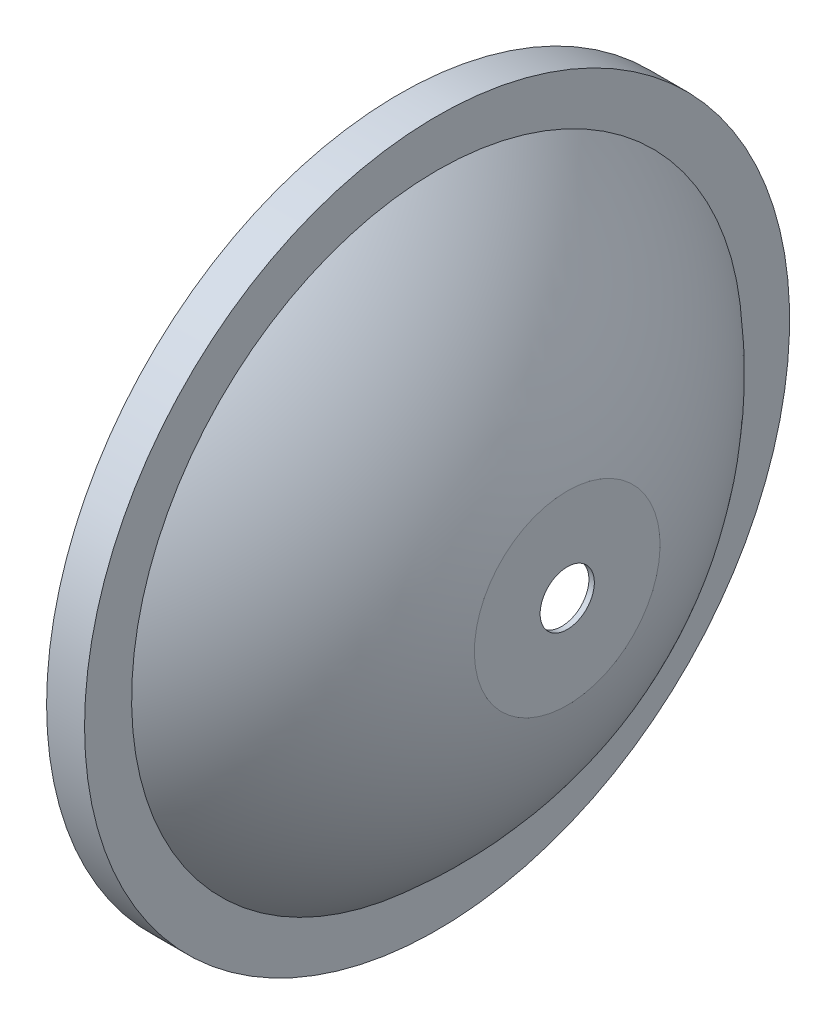
ISO-10303-21;
HEADER;
FILE_DESCRIPTION(('STEP AP214'),'2;1');
FILE_NAME('part.step','',(''),(''),'','','');
FILE_SCHEMA(('AUTOMOTIVE_DESIGN { 1 0 10303 214 1 1 1 1 }'));
ENDSEC;
DATA;
#1=APPLICATION_CONTEXT('core data for automotive mechanical design processes');
#2=APPLICATION_PROTOCOL_DEFINITION('international standard','automotive_design',2000,#1);
#3=PRODUCT_CONTEXT('',#1,'mechanical');
#4=PRODUCT('Part','Part','',(#3));
#5=PRODUCT_RELATED_PRODUCT_CATEGORY('part','',(#4));
#6=PRODUCT_DEFINITION_FORMATION('','',#4);
#7=PRODUCT_DEFINITION_CONTEXT('part definition',#1,'design');
#8=PRODUCT_DEFINITION('design','',#6,#7);
#9=PRODUCT_DEFINITION_SHAPE('','',#8);
#10=(LENGTH_UNIT() NAMED_UNIT(*) SI_UNIT(.MILLI.,.METRE.));
#11=(NAMED_UNIT(*) PLANE_ANGLE_UNIT() SI_UNIT($,.RADIAN.));
#12=(NAMED_UNIT(*) SI_UNIT($,.STERADIAN.) SOLID_ANGLE_UNIT());
#13=UNCERTAINTY_MEASURE_WITH_UNIT(LENGTH_MEASURE(1.E-05),#10,'distance_accuracy_value','');
#14=(GEOMETRIC_REPRESENTATION_CONTEXT(3) GLOBAL_UNCERTAINTY_ASSIGNED_CONTEXT((#13)) GLOBAL_UNIT_ASSIGNED_CONTEXT((#10,
#11,#12)) REPRESENTATION_CONTEXT('',''));
#15=CARTESIAN_POINT('',(0.,0.,0.));
#16=DIRECTION('',(0.,0.,1.));
#17=DIRECTION('',(1.,0.,0.));
#18=AXIS2_PLACEMENT_3D('',#15,#16,#17);
#19=CARTESIAN_POINT('',(-29.9929573971954,65.,0.));
#20=DIRECTION('',(1.,0.,0.));
#21=DIRECTION('',(0.,0.,-1.));
#22=AXIS2_PLACEMENT_3D('',#19,#20,#21);
#23=PLANE('',#22);
#24=CARTESIAN_POINT('',(-29.9929573971954,0.,0.));
#25=DIRECTION('',(-1.,0.,0.));
#26=DIRECTION('',(0.,0.,1.));
#27=AXIS2_PLACEMENT_3D('',#24,#25,#26);
#28=CIRCLE('',#27,64.);
#29=CARTESIAN_POINT('',(-29.9929573971954,0.,64.));
#30=VERTEX_POINT('',#29);
#31=EDGE_CURVE('E10',#30,#30,#28,.T.);
#32=ORIENTED_EDGE('',*,*,#31,.F.);
#33=EDGE_LOOP('',(#32));
#34=FACE_BOUND('',#33,.T.);
#35=CARTESIAN_POINT('',(-29.9929573971954,0.,0.));
#36=DIRECTION('',(-1.,0.,0.));
#37=DIRECTION('',(0.,0.,1.));
#38=AXIS2_PLACEMENT_3D('',#35,#36,#37);
#39=CIRCLE('',#38,65.);
#40=CARTESIAN_POINT('',(-29.9929573971954,0.,65.));
#41=VERTEX_POINT('',#40);
#42=EDGE_CURVE('E84',#41,#41,#39,.T.);
#43=ORIENTED_EDGE('',*,*,#42,.T.);
#44=EDGE_LOOP('',(#43));
#45=FACE_BOUND('',#44,.T.);
#46=ADVANCED_FACE('F41',(#34,#45),#23,.F.);
#47=CARTESIAN_POINT('',(-81.8497480097025,0.,0.));
#48=DIRECTION('',(-1.,0.,0.));
#49=DIRECTION('',(0.,0.,1.));
#50=AXIS2_PLACEMENT_3D('',#47,#48,#49);
#51=CYLINDRICAL_SURFACE('',#50,64.);
#52=CARTESIAN_POINT('',(-23.9929573971954,0.,0.));
#53=DIRECTION('',(-1.,0.,0.));
#54=DIRECTION('',(0.,0.,1.));
#55=AXIS2_PLACEMENT_3D('',#52,#53,#54);
#56=CIRCLE('',#55,64.);
#57=CARTESIAN_POINT('',(-23.9929573971954,0.,64.));
#58=VERTEX_POINT('',#57);
#59=EDGE_CURVE('E48',#58,#58,#56,.T.);
#60=ORIENTED_EDGE('',*,*,#59,.F.);
#61=EDGE_LOOP('',(#60));
#62=FACE_BOUND('',#61,.T.);
#63=ORIENTED_EDGE('',*,*,#31,.T.);
#64=EDGE_LOOP('',(#63));
#65=FACE_BOUND('',#64,.T.);
#66=ADVANCED_FACE('F134',(#62,#65),#51,.F.);
#67=CARTESIAN_POINT('',(-23.9929573971954,64.,0.));
#68=DIRECTION('',(1.,0.,0.));
#69=DIRECTION('',(0.,0.,-1.));
#70=AXIS2_PLACEMENT_3D('',#67,#68,#69);
#71=PLANE('',#70);
#72=CARTESIAN_POINT('',(-23.9929573971954,0.,0.));
#73=DIRECTION('',(-1.,0.,0.));
#74=DIRECTION('',(0.,0.,1.));
#75=AXIS2_PLACEMENT_3D('',#72,#73,#74);
#76=CIRCLE('',#75,55.8569601750758);
#77=CARTESIAN_POINT('',(-23.9929573971954,55.8569601750758,0.));
#78=VERTEX_POINT('',#77);
#79=EDGE_CURVE('E53',#78,#78,#76,.T.);
#80=ORIENTED_EDGE('',*,*,#79,.F.);
#81=EDGE_LOOP('',(#80));
#82=FACE_BOUND('',#81,.T.);
#83=ORIENTED_EDGE('',*,*,#59,.T.);
#84=EDGE_LOOP('',(#83));
#85=FACE_BOUND('',#84,.T.);
#86=ADVANCED_FACE('F129',(#82,#85),#71,.F.);
#87=CARTESIAN_POINT('',(-70.9929573971954,0.,0.));
#88=DIRECTION('',(-1.,0.,0.));
#89=DIRECTION('',(0.,1.,0.));
#90=AXIS2_PLACEMENT_3D('',#87,#88,#89);
#91=SPHERICAL_SURFACE('',#90,73.);
#92=CARTESIAN_POINT('',(0.,0.,0.));
#93=DIRECTION('',(-1.,0.,0.));
#94=DIRECTION('',(0.,0.,1.));
#95=AXIS2_PLACEMENT_3D('',#92,#93,#94);
#96=CIRCLE('',#95,17.);
#97=CARTESIAN_POINT('',(0.,17.,0.));
#98=VERTEX_POINT('',#97);
#99=EDGE_CURVE('E58',#98,#98,#96,.T.);
#100=CARTESIAN_POINT('',(0.,17.,0.));
#101=CARTESIAN_POINT('',(-0.112670572638873,17.4705215884802,0.));
#102=CARTESIAN_POINT('',(-0.230020169997343,17.9399227117787,0.));
#103=CARTESIAN_POINT('',(-0.474028120364987,18.8762992173912,0.));
#104=CARTESIAN_POINT('',(-0.600686473374161,19.3432745997054,0.));
#105=CARTESIAN_POINT('',(-0.863262641254749,20.2746148127284,0.));
#106=CARTESIAN_POINT('',(-0.999180456126163,20.7389796434374,0.));
#107=CARTESIAN_POINT('',(-1.28022160737403,21.6649152316035,0.));
#108=CARTESIAN_POINT('',(-1.42534494375048,22.1264859890607,0.));
#109=CARTESIAN_POINT('',(-1.72473982267244,23.0466509447989,0.));
#110=CARTESIAN_POINT('',(-1.87901136521795,23.50524514308,0.));
#111=CARTESIAN_POINT('',(-2.19664165381386,24.4192756897043,0.));
#112=CARTESIAN_POINT('',(-2.36000039986426,24.8747120380474,0.));
#113=CARTESIAN_POINT('',(-2.69574051935861,25.7822468374742,0.));
#114=CARTESIAN_POINT('',(-2.86812189280257,26.2343452885578,0.));
#115=CARTESIAN_POINT('',(-3.22183911900177,27.1350255670289,0.));
#116=CARTESIAN_POINT('',(-3.40317497175703,27.5836073944165,0.));
#117=CARTESIAN_POINT('',(-3.77472946991124,28.4770770889206,0.));
#118=CARTESIAN_POINT('',(-3.96494811531021,28.9219649560372,0.));
#119=CARTESIAN_POINT('',(-4.35419300011169,29.8078708538416,0.));
#120=CARTESIAN_POINT('',(-4.55321923951421,30.2488888845294,0.));
#121=CARTESIAN_POINT('',(-4.96000063190091,31.1268807631437,0.));
#122=CARTESIAN_POINT('',(-5.1677557848851,31.5638546110703,0.));
#123=CARTESIAN_POINT('',(-5.59191287321195,32.433585376611,0.));
#124=CARTESIAN_POINT('',(-5.80831480855461,32.8663422942252,0.));
#125=CARTESIAN_POINT('',(-6.24967991207591,33.7274681186546,0.));
#126=CARTESIAN_POINT('',(-6.47464308025454,34.1558370254699,0.));
#127=CARTESIAN_POINT('',(-6.933041715437,35.0080174825144,0.));
#128=CARTESIAN_POINT('',(-7.16647718244084,35.4318290327436,0.));
#129=CARTESIAN_POINT('',(-7.64172813193516,36.274727232475,0.));
#130=CARTESIAN_POINT('',(-7.88354361442565,36.6938138819772,0.));
#131=CARTESIAN_POINT('',(-8.37545899870832,37.527096603994,0.));
#132=CARTESIAN_POINT('',(-8.62555890050051,37.9412926765087,0.));
#133=CARTESIAN_POINT('',(-9.13394425214721,38.7646305016672,0.));
#134=CARTESIAN_POINT('',(-9.39222970200173,39.173772254311,0.));
#135=CARTESIAN_POINT('',(-9.91688404256569,39.9868396949536,0.));
#136=CARTESIAN_POINT('',(-10.1832529332751,40.3907653829524,0.));
#137=CARTESIAN_POINT('',(-10.7239688527393,41.1932410115816,0.));
#138=CARTESIAN_POINT('',(-10.998315881494,41.591790952212,0.));
#139=CARTESIAN_POINT('',(-11.5548796202656,42.3833575285593,0.));
#140=CARTESIAN_POINT('',(-11.8370963302826,42.7763741642762,0.));
#141=CARTESIAN_POINT('',(-12.4092878636989,43.5567187607158,0.));
#142=CARTESIAN_POINT('',(-12.6992626870981,43.9440467214384,0.));
#143=CARTESIAN_POINT('',(-13.2868558124062,44.7128608466967,0.));
#144=CARTESIAN_POINT('',(-13.5844741143149,45.0943470112324,0.));
#145=CARTESIAN_POINT('',(-14.1872365401005,45.8513267323385,0.));
#146=CARTESIAN_POINT('',(-14.4923806639774,46.2268202889089,0.));
#147=CARTESIAN_POINT('',(-15.1100741019797,46.9716663513658,0.));
#148=CARTESIAN_POINT('',(-15.4226234161051,47.3410188572524,0.));
#149=CARTESIAN_POINT('',(-16.0550036754797,48.0734368032704,0.));
#150=CARTESIAN_POINT('',(-16.374834620729,48.4365022434018,0.));
#151=CARTESIAN_POINT('',(-17.0216517043532,49.1562025285684,0.));
#152=CARTESIAN_POINT('',(-17.348637842728,49.5128373736036,0.));
#153=CARTESIAN_POINT('',(-18.0096360468915,50.2195354803658,0.));
#154=CARTESIAN_POINT('',(-18.3436481126801,50.5695987420928,0.));
#155=CARTESIAN_POINT('',(-19.0185661249594,51.2630152959021,0.));
#156=CARTESIAN_POINT('',(-19.3594720714501,51.6063685879843,0.));
#157=CARTESIAN_POINT('',(-20.0480430860019,52.2862294540537,0.));
#158=CARTESIAN_POINT('',(-20.395708154063,52.6227370280408,0.));
#159=CARTESIAN_POINT('',(-21.0976599323541,53.2887734707984,0.));
#160=CARTESIAN_POINT('',(-21.4519466425842,53.6183023395688,0.));
#161=CARTESIAN_POINT('',(-22.1670017880071,54.2702509382611,0.));
#162=CARTESIAN_POINT('',(-22.5277702232,54.592670668183,0.));
#163=CARTESIAN_POINT('',(-23.2556456675121,55.230274132472,0.));
#164=CARTESIAN_POINT('',(-23.6227526766313,55.5454578668391,0.));
#165=CARTESIAN_POINT('',(-23.9929573971954,55.8569601750758,0.));
#166=B_SPLINE_CURVE_WITH_KNOTS('',3,(#100,#101,#102,#103,#104,#105,#106,#107,#108,#109,#110,
#111,#112,#113,#114,#115,#116,#117,#118,#119,#120,#121,#122,#123,#124,#125,#126,#127,#128,#129,
#130,#131,#132,#133,#134,#135,#136,#137,#138,#139,#140,#141,#142,#143,#144,#145,#146,#147,#148,
#149,#150,#151,#152,#153,#154,#155,#156,#157,#158,#159,#160,#161,#162,#163,#164,#165),
.UNSPECIFIED.,.F.,.F.,(4,2,2,2,2,2,2,2,2,2,2,2,2,2,2,2,2,2,2,2,2,2,2,2,2,2,2,2,2,2,2,2,4),(0.,
1.45144668774807,2.90289337549614,4.3543400632442,5.80578675099227,7.25723343874034,
8.70868012648841,10.1601268142365,11.6115735019845,13.0630201897326,14.5144668774807,
15.9659135652288,17.4173602529768,18.8688069407249,20.320253628473,21.771700316221,
23.2231470039691,24.6745936917172,26.1260403794652,27.5774870672133,29.0289337549614,
30.4803804427095,31.9318271304575,33.3832738182056,34.8347205059537,36.2861671937017,
37.7376138814498,39.1890605691979,40.6405072569459,42.091953944694,43.5434006324421,
44.9948473201901,46.4462940079382),.UNSPECIFIED.);
#167=EDGE_CURVE('BSEAM123',#98,#78,#166,.T.);
#168=ORIENTED_EDGE('',*,*,#99,.F.);
#169=ORIENTED_EDGE('',*,*,#79,.T.);
#170=ORIENTED_EDGE('',*,*,#167,.T.);
#171=ORIENTED_EDGE('',*,*,#167,.F.);
#172=EDGE_LOOP('',(#168,#170,#169,#171));
#173=FACE_BOUND('',#172,.T.);
#174=ADVANCED_FACE('F123',(#173),#91,.F.);
#175=CARTESIAN_POINT('',(0.,5.,0.));
#176=DIRECTION('',(1.,0.,0.));
#177=DIRECTION('',(0.,0.,-1.));
#178=AXIS2_PLACEMENT_3D('',#175,#176,#177);
#179=PLANE('',#178);
#180=CARTESIAN_POINT('',(0.,0.,0.));
#181=DIRECTION('',(-1.,0.,0.));
#182=DIRECTION('',(0.,0.,1.));
#183=AXIS2_PLACEMENT_3D('',#180,#181,#182);
#184=CIRCLE('',#183,5.);
#185=CARTESIAN_POINT('',(0.,0.,5.));
#186=VERTEX_POINT('',#185);
#187=EDGE_CURVE('E64',#186,#186,#184,.T.);
#188=ORIENTED_EDGE('',*,*,#187,.F.);
#189=EDGE_LOOP('',(#188));
#190=FACE_BOUND('',#189,.T.);
#191=ORIENTED_EDGE('',*,*,#99,.T.);
#192=EDGE_LOOP('',(#191));
#193=FACE_BOUND('',#192,.T.);
#194=ADVANCED_FACE('F117',(#190,#193),#179,.F.);
#195=CARTESIAN_POINT('',(-81.8497480097025,0.,0.));
#196=DIRECTION('',(-1.,0.,0.));
#197=DIRECTION('',(0.,0.,1.));
#198=AXIS2_PLACEMENT_3D('',#195,#196,#197);
#199=CYLINDRICAL_SURFACE('',#198,5.);
#200=CARTESIAN_POINT('',(1.,0.,0.));
#201=DIRECTION('',(-1.,0.,0.));
#202=DIRECTION('',(0.,0.,1.));
#203=AXIS2_PLACEMENT_3D('',#200,#201,#202);
#204=CIRCLE('',#203,5.);
#205=CARTESIAN_POINT('',(1.,0.,5.));
#206=VERTEX_POINT('',#205);
#207=EDGE_CURVE('E68',#206,#206,#204,.T.);
#208=ORIENTED_EDGE('',*,*,#207,.F.);
#209=EDGE_LOOP('',(#208));
#210=FACE_BOUND('',#209,.T.);
#211=ORIENTED_EDGE('',*,*,#187,.T.);
#212=EDGE_LOOP('',(#211));
#213=FACE_BOUND('',#212,.T.);
#214=ADVANCED_FACE('F111',(#210,#213),#199,.F.);
#215=CARTESIAN_POINT('',(1.,5.,0.));
#216=DIRECTION('',(-1.,0.,0.));
#217=DIRECTION('',(0.,0.,1.));
#218=AXIS2_PLACEMENT_3D('',#215,#216,#217);
#219=PLANE('',#218);
#220=CARTESIAN_POINT('',(1.,0.,0.));
#221=DIRECTION('',(-1.,0.,0.));
#222=DIRECTION('',(0.,0.,1.));
#223=AXIS2_PLACEMENT_3D('',#220,#221,#222);
#224=CIRCLE('',#223,17.1176541969282);
#225=CARTESIAN_POINT('',(1.,17.1176541969281,0.));
#226=VERTEX_POINT('',#225);
#227=EDGE_CURVE('E72',#226,#226,#224,.T.);
#228=ORIENTED_EDGE('',*,*,#227,.F.);
#229=EDGE_LOOP('',(#228));
#230=FACE_BOUND('',#229,.T.);
#231=ORIENTED_EDGE('',*,*,#207,.T.);
#232=EDGE_LOOP('',(#231));
#233=FACE_BOUND('',#232,.T.);
#234=ADVANCED_FACE('F105',(#230,#233),#219,.F.);
#235=CARTESIAN_POINT('',(-70.9929573971954,0.,0.));
#236=DIRECTION('',(-1.,0.,0.));
#237=DIRECTION('',(0.,1.,0.));
#238=AXIS2_PLACEMENT_3D('',#235,#236,#237);
#239=SPHERICAL_SURFACE('',#238,74.);
#240=CARTESIAN_POINT('',(-22.9929573971954,0.,0.));
#241=DIRECTION('',(-1.,0.,0.));
#242=DIRECTION('',(0.,0.,1.));
#243=AXIS2_PLACEMENT_3D('',#240,#241,#242);
#244=CIRCLE('',#243,56.3205113613149);
#245=CARTESIAN_POINT('',(-22.9929573971954,56.3205113613149,0.));
#246=VERTEX_POINT('',#245);
#247=EDGE_CURVE('E76',#246,#246,#244,.T.);
#248=CARTESIAN_POINT('',(-22.9929573971954,56.3205113613149,0.));
#249=CARTESIAN_POINT('',(-22.6224413895323,56.0047344228491,0.));
#250=CARTESIAN_POINT('',(-22.2550423613412,55.6853002306746,0.));
#251=CARTESIAN_POINT('',(-21.5266194076841,55.0392439667616,0.));
#252=CARTESIAN_POINT('',(-21.165595482218,54.7126218950229,0.));
#253=CARTESIAN_POINT('',(-20.4500638777918,54.0523164998345,0.));
#254=CARTESIAN_POINT('',(-20.0955561988317,53.7186331763848,0.));
#255=CARTESIAN_POINT('',(-19.3931950277699,53.0443354061621,0.));
#256=CARTESIAN_POINT('',(-19.0453415356683,52.7037209593891,0.));
#257=CARTESIAN_POINT('',(-18.3564242651453,52.0156935695762,0.));
#258=CARTESIAN_POINT('',(-18.015360486724,51.6682806265364,0.));
#259=CARTESIAN_POINT('',(-17.340155478016,50.9667915731246,0.));
#260=CARTESIAN_POINT('',(-17.0060142477294,50.6127154627527,0.));
#261=CARTESIAN_POINT('',(-16.3447844862085,49.8980379844877,0.));
#262=CARTESIAN_POINT('',(-16.0176959549742,49.5374366165945,0.));
#263=CARTESIAN_POINT('',(-15.3706989920151,48.8098490785565,0.));
#264=CARTESIAN_POINT('',(-15.0507905602904,48.4428629084116,0.));
#265=CARTESIAN_POINT('',(-14.4182784010738,47.702648706988,0.));
#266=CARTESIAN_POINT('',(-14.1056746735818,47.3294206757092,0.));
#267=CARTESIAN_POINT('',(-13.4878936821208,46.5768681246217,0.));
#268=CARTESIAN_POINT('',(-13.1827164181518,46.1975436048131,0.));
#269=CARTESIAN_POINT('',(-12.5799072204807,45.4329458237818,0.));
#270=CARTESIAN_POINT('',(-12.2822752867787,45.0476725625591,0.));
#271=CARTESIAN_POINT('',(-11.6946726774573,44.2713273628735,0.));
#272=CARTESIAN_POINT('',(-11.4047020018379,43.8802554244108,0.));
#273=CARTESIAN_POINT('',(-10.8325348524376,43.0924651930022,0.));
#274=CARTESIAN_POINT('',(-10.5503383786566,42.6957469000563,0.));
#275=CARTESIAN_POINT('',(-9.99382954863119,41.8968184816987,0.));
#276=CARTESIAN_POINT('',(-9.71951719238671,41.4946083562868,0.));
#277=CARTESIAN_POINT('',(-9.17888344226411,40.6848529340857,0.));
#278=CARTESIAN_POINT('',(-8.91256204838598,40.2773076372964,0.));
#279=CARTESIAN_POINT('',(-8.38801395534114,39.4570406114818,0.));
#280=CARTESIAN_POINT('',(-8.12978725617442,39.0443188824564,0.));
#281=CARTESIAN_POINT('',(-7.62152913200895,38.2138597475343,0.));
#282=CARTESIAN_POINT('',(-7.3714977070102,37.7961223416376,0.));
#283=CARTESIAN_POINT('',(-6.87972751857296,36.9557945619467,0.));
#284=CARTESIAN_POINT('',(-6.63798875513446,36.5332041881525,0.));
#285=CARTESIAN_POINT('',(-6.1628980472133,35.6833350718748,0.));
#286=CARTESIAN_POINT('',(-5.92954610273063,35.2560563293912,0.));
#287=CARTESIAN_POINT('',(-5.47131992344549,34.3969769010648,0.));
#288=CARTESIAN_POINT('',(-5.24644568864301,33.9651762152221,0.));
#289=CARTESIAN_POINT('',(-4.80526251737,33.0972210868075,0.));
#290=CARTESIAN_POINT('',(-4.58895358089948,32.6610666442356,0.));
#291=CARTESIAN_POINT('',(-4.16498525875141,31.7845738847841,0.));
#292=CARTESIAN_POINT('',(-3.95732587307387,31.3442355679044,0.));
#293=CARTESIAN_POINT('',(-3.55073753597435,30.4595465718784,0.));
#294=CARTESIAN_POINT('',(-3.35180858455238,30.015195892732,0.));
#295=CARTESIAN_POINT('',(-2.9627585988914,29.122655247038,0.));
#296=CARTESIAN_POINT('',(-2.77263756465238,28.6744652804903,0.));
#297=CARTESIAN_POINT('',(-2.40127746569182,27.7744206302389,0.));
#298=CARTESIAN_POINT('',(-2.22003840097026,27.3225659465352,0.));
#299=CARTESIAN_POINT('',(-1.86651283348735,26.4153678597193,0.));
#300=CARTESIAN_POINT('',(-1.694226330726,25.9600244566072,0.));
#301=CARTESIAN_POINT('',(-1.35867299391867,25.0460262872339,0.));
#302=CARTESIAN_POINT('',(-1.1954061598727,24.5873715209726,0.));
#303=CARTESIAN_POINT('',(-0.877955749080876,23.6669292726328,0.));
#304=CARTESIAN_POINT('',(-0.723772172335026,23.2051417905542,0.));
#305=CARTESIAN_POINT('',(-0.424548345469199,22.2786139732744,0.));
#306=CARTESIAN_POINT('',(-0.279508095349223,21.8138736380732,0.));
#307=CARTESIAN_POINT('',(0.00137263996750556,20.8816211454133,0.));
#308=CARTESIAN_POINT('',(0.137213125164258,20.4141089879546,0.));
#309=CARTESIAN_POINT('',(0.399641215538045,19.4764948939744,0.));
#310=CARTESIAN_POINT('',(0.526228820715081,19.0063929574529,0.));
#311=CARTESIAN_POINT('',(0.770102610710882,18.0637826084173,0.));
#312=CARTESIAN_POINT('',(0.887388795529648,17.5912741959032,0.));
#313=CARTESIAN_POINT('',(1.,17.1176541969281,0.));
#314=B_SPLINE_CURVE_WITH_KNOTS('',3,(#248,#249,#250,#251,#252,#253,#254,#255,#256,#257,#258,
#259,#260,#261,#262,#263,#264,#265,#266,#267,#268,#269,#270,#271,#272,#273,#274,#275,#276,#277,
#278,#279,#280,#281,#282,#283,#284,#285,#286,#287,#288,#289,#290,#291,#292,#293,#294,#295,#296,
#297,#298,#299,#300,#301,#302,#303,#304,#305,#306,#307,#308,#309,#310,#311,#312,#313),
.UNSPECIFIED.,.F.,.F.,(4,2,2,2,2,2,2,2,2,2,2,2,2,2,2,2,2,2,2,2,2,2,2,2,2,2,2,2,2,2,2,2,4),(0.,
1.46044696389162,2.92089392778324,4.38134089167486,5.84178785556648,7.3022348194581,
8.76268178334971,10.2231287472413,11.683575711133,13.1440226750246,14.6044696389162,
16.0649166028078,17.5253635666994,18.9858105305911,20.4462574944827,21.9067044583743,
23.3671514222659,24.8275983861575,26.2880453500492,27.7484923139408,29.2089392778324,
30.669386241724,32.1298332056156,33.5902801695072,35.0507271333989,36.5111740972905,
37.9716210611821,39.4320680250737,40.8925149889653,42.352961952857,43.8134089167486,
45.2738558806402,46.7343028445318),.UNSPECIFIED.);
#315=EDGE_CURVE('BSEAM99',#246,#226,#314,.T.);
#316=ORIENTED_EDGE('',*,*,#247,.F.);
#317=ORIENTED_EDGE('',*,*,#227,.T.);
#318=ORIENTED_EDGE('',*,*,#315,.T.);
#319=ORIENTED_EDGE('',*,*,#315,.F.);
#320=EDGE_LOOP('',(#316,#318,#317,#319));
#321=FACE_BOUND('',#320,.T.);
#322=ADVANCED_FACE('F99',(#321),#239,.T.);
#323=CARTESIAN_POINT('',(-22.9929573971954,65.,0.));
#324=DIRECTION('',(-1.,0.,0.));
#325=DIRECTION('',(0.,0.,1.));
#326=AXIS2_PLACEMENT_3D('',#323,#324,#325);
#327=PLANE('',#326);
#328=CARTESIAN_POINT('',(-22.9929573971954,0.,0.));
#329=DIRECTION('',(-1.,0.,0.));
#330=DIRECTION('',(0.,0.,1.));
#331=AXIS2_PLACEMENT_3D('',#328,#329,#330);
#332=CIRCLE('',#331,65.);
#333=CARTESIAN_POINT('',(-22.9929573971954,0.,65.));
#334=VERTEX_POINT('',#333);
#335=EDGE_CURVE('E80',#334,#334,#332,.T.);
#336=ORIENTED_EDGE('',*,*,#335,.F.);
#337=EDGE_LOOP('',(#336));
#338=FACE_BOUND('',#337,.T.);
#339=ORIENTED_EDGE('',*,*,#247,.T.);
#340=EDGE_LOOP('',(#339));
#341=FACE_BOUND('',#340,.T.);
#342=ADVANCED_FACE('F93',(#338,#341),#327,.F.);
#343=CARTESIAN_POINT('',(-81.8497480097025,0.,0.));
#344=DIRECTION('',(-1.,0.,0.));
#345=DIRECTION('',(0.,0.,1.));
#346=AXIS2_PLACEMENT_3D('',#343,#344,#345);
#347=CYLINDRICAL_SURFACE('',#346,65.);
#348=ORIENTED_EDGE('',*,*,#42,.F.);
#349=EDGE_LOOP('',(#348));
#350=FACE_BOUND('',#349,.T.);
#351=ORIENTED_EDGE('',*,*,#335,.T.);
#352=EDGE_LOOP('',(#351));
#353=FACE_BOUND('',#352,.T.);
#354=ADVANCED_FACE('F90',(#350,#353),#347,.T.);
#355=CLOSED_SHELL('',(#46,#66,#86,#174,#194,#214,#234,#322,#342,#354));
#356=MANIFOLD_SOLID_BREP('B2',#355);
#357=ADVANCED_BREP_SHAPE_REPRESENTATION('',(#18,#356),#14);
#358=SHAPE_DEFINITION_REPRESENTATION(#9,#357);
ENDSEC;
END-ISO-10303-21;
